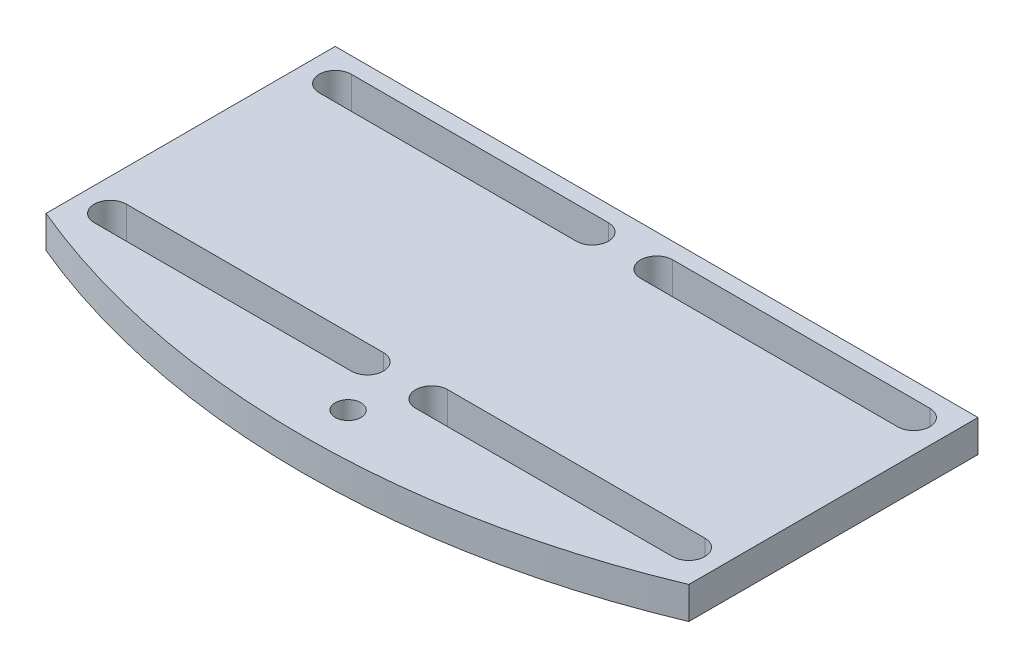
ISO-10303-21;
HEADER;
FILE_DESCRIPTION(('STEP AP214'),'2;1');
FILE_NAME('part.step','',(''),(''),'','','');
FILE_SCHEMA(('AUTOMOTIVE_DESIGN { 1 0 10303 214 1 1 1 1 }'));
ENDSEC;
DATA;
#1=APPLICATION_CONTEXT('core data for automotive mechanical design processes');
#2=APPLICATION_PROTOCOL_DEFINITION('international standard','automotive_design',2000,#1);
#3=PRODUCT_CONTEXT('',#1,'mechanical');
#4=PRODUCT('Part','Part','',(#3));
#5=PRODUCT_RELATED_PRODUCT_CATEGORY('part','',(#4));
#6=PRODUCT_DEFINITION_FORMATION('','',#4);
#7=PRODUCT_DEFINITION_CONTEXT('part definition',#1,'design');
#8=PRODUCT_DEFINITION('design','',#6,#7);
#9=PRODUCT_DEFINITION_SHAPE('','',#8);
#10=(LENGTH_UNIT() NAMED_UNIT(*) SI_UNIT(.MILLI.,.METRE.));
#11=(NAMED_UNIT(*) PLANE_ANGLE_UNIT() SI_UNIT($,.RADIAN.));
#12=(NAMED_UNIT(*) SI_UNIT($,.STERADIAN.) SOLID_ANGLE_UNIT());
#13=UNCERTAINTY_MEASURE_WITH_UNIT(LENGTH_MEASURE(1.E-05),#10,'distance_accuracy_value','');
#14=(GEOMETRIC_REPRESENTATION_CONTEXT(3) GLOBAL_UNCERTAINTY_ASSIGNED_CONTEXT((#13)) GLOBAL_UNIT_ASSIGNED_CONTEXT((#10,
#11,#12)) REPRESENTATION_CONTEXT('',''));
#15=CARTESIAN_POINT('',(0.,0.,0.));
#16=DIRECTION('',(0.,0.,1.));
#17=DIRECTION('',(1.,0.,0.));
#18=AXIS2_PLACEMENT_3D('',#15,#16,#17);
#19=CARTESIAN_POINT('',(-3.05311331771918E-13,5.,-79.9999999999985));
#20=DIRECTION('',(0.,1.,0.));
#21=DIRECTION('',(0.,0.,1.));
#22=AXIS2_PLACEMENT_3D('',#19,#20,#21);
#23=PLANE('',#22);
#24=CARTESIAN_POINT('',(0.,5.,43.));
#25=DIRECTION('',(0.,1.,0.));
#26=DIRECTION('',(0.,0.,1.));
#27=AXIS2_PLACEMENT_3D('',#24,#25,#26);
#28=CIRCLE('',#27,2.);
#29=CARTESIAN_POINT('',(0.,5.,45.));
#30=VERTEX_POINT('',#29);
#31=EDGE_CURVE('E512',#30,#30,#28,.T.);
#32=ORIENTED_EDGE('',*,*,#31,.F.);
#33=EDGE_LOOP('',(#32));
#34=FACE_BOUND('',#33,.T.);
#35=CARTESIAN_POINT('',(-45.,5.,35.));
#36=DIRECTION('',(0.,1.,0.));
#37=DIRECTION('',(0.,0.,1.));
#38=AXIS2_PLACEMENT_3D('',#35,#36,#37);
#39=CIRCLE('',#38,2.5);
#40=CARTESIAN_POINT('',(-45.,5.,32.5));
#41=VERTEX_POINT('',#40);
#42=CARTESIAN_POINT('',(-45.,5.,37.5));
#43=VERTEX_POINT('',#42);
#44=EDGE_CURVE('E282',#41,#43,#39,.T.);
#45=ORIENTED_EDGE('',*,*,#44,.F.);
#46=DIRECTION('',(-1.,0.,0.));
#47=VECTOR('',#46,1.);
#48=CARTESIAN_POINT('',(-45.,5.,32.5));
#49=LINE('',#48,#47);
#50=CARTESIAN_POINT('',(-5.,5.,32.5));
#51=VERTEX_POINT('',#50);
#52=EDGE_CURVE('E293',#51,#41,#49,.T.);
#53=ORIENTED_EDGE('',*,*,#52,.F.);
#54=CARTESIAN_POINT('',(-5.,5.,35.));
#55=DIRECTION('',(0.,1.,0.));
#56=DIRECTION('',(0.,0.,1.));
#57=AXIS2_PLACEMENT_3D('',#54,#55,#56);
#58=CIRCLE('',#57,2.5);
#59=CARTESIAN_POINT('',(-5.,5.,37.5));
#60=VERTEX_POINT('',#59);
#61=EDGE_CURVE('E289',#60,#51,#58,.T.);
#62=ORIENTED_EDGE('',*,*,#61,.F.);
#63=DIRECTION('',(1.,0.,0.));
#64=VECTOR('',#63,1.);
#65=CARTESIAN_POINT('',(-45.,5.,37.5));
#66=LINE('',#65,#64);
#67=EDGE_CURVE('E285',#43,#60,#66,.T.);
#68=ORIENTED_EDGE('',*,*,#67,.F.);
#69=EDGE_LOOP('',(#45,#53,#62,#68));
#70=FACE_BOUND('',#69,.T.);
#71=CARTESIAN_POINT('',(-45.,5.,0.));
#72=DIRECTION('',(0.,1.,0.));
#73=DIRECTION('',(0.,0.,1.));
#74=AXIS2_PLACEMENT_3D('',#71,#72,#73);
#75=CIRCLE('',#74,2.5);
#76=CARTESIAN_POINT('',(-45.,5.,-2.5));
#77=VERTEX_POINT('',#76);
#78=CARTESIAN_POINT('',(-45.,5.,2.5));
#79=VERTEX_POINT('',#78);
#80=EDGE_CURVE('E325',#77,#79,#75,.T.);
#81=ORIENTED_EDGE('',*,*,#80,.F.);
#82=DIRECTION('',(-1.,0.,0.));
#83=VECTOR('',#82,1.);
#84=CARTESIAN_POINT('',(-45.,5.,-2.5));
#85=LINE('',#84,#83);
#86=CARTESIAN_POINT('',(-5.,5.,-2.5));
#87=VERTEX_POINT('',#86);
#88=EDGE_CURVE('E336',#87,#77,#85,.T.);
#89=ORIENTED_EDGE('',*,*,#88,.F.);
#90=CARTESIAN_POINT('',(-5.,5.,0.));
#91=DIRECTION('',(0.,1.,0.));
#92=DIRECTION('',(0.,0.,1.));
#93=AXIS2_PLACEMENT_3D('',#90,#91,#92);
#94=CIRCLE('',#93,2.5);
#95=CARTESIAN_POINT('',(-5.,5.,2.5));
#96=VERTEX_POINT('',#95);
#97=EDGE_CURVE('E332',#96,#87,#94,.T.);
#98=ORIENTED_EDGE('',*,*,#97,.F.);
#99=DIRECTION('',(1.,0.,0.));
#100=VECTOR('',#99,1.);
#101=CARTESIAN_POINT('',(-45.,5.,2.5));
#102=LINE('',#101,#100);
#103=EDGE_CURVE('E328',#79,#96,#102,.T.);
#104=ORIENTED_EDGE('',*,*,#103,.F.);
#105=EDGE_LOOP('',(#81,#89,#98,#104));
#106=FACE_BOUND('',#105,.T.);
#107=DIRECTION('',(0.,0.,1.));
#108=VECTOR('',#107,1.);
#109=CARTESIAN_POINT('',(-50.,5.,40.));
#110=LINE('',#109,#108);
#111=CARTESIAN_POINT('',(-50.,5.,-4.99999999999999));
#112=VERTEX_POINT('',#111);
#113=CARTESIAN_POINT('',(-50.,5.,40.0000000000001));
#114=VERTEX_POINT('',#113);
#115=EDGE_CURVE('E356',#112,#114,#110,.T.);
#116=ORIENTED_EDGE('',*,*,#115,.T.);
#117=CARTESIAN_POINT('',(-3.05311331771918E-13,5.,-79.9999999999985));
#118=DIRECTION('',(0.,1.,0.));
#119=DIRECTION('',(0.,0.,1.));
#120=AXIS2_PLACEMENT_3D('',#117,#118,#119);
#121=CIRCLE('',#120,129.999999999999);
#122=CARTESIAN_POINT('',(50.,5.,40.));
#123=VERTEX_POINT('',#122);
#124=EDGE_CURVE('E360',#114,#123,#121,.T.);
#125=ORIENTED_EDGE('',*,*,#124,.T.);
#126=DIRECTION('',(0.,0.,-1.));
#127=VECTOR('',#126,1.);
#128=CARTESIAN_POINT('',(50.,5.,40.));
#129=LINE('',#128,#127);
#130=CARTESIAN_POINT('',(50.,5.,-5.));
#131=VERTEX_POINT('',#130);
#132=EDGE_CURVE('E364',#123,#131,#129,.T.);
#133=ORIENTED_EDGE('',*,*,#132,.T.);
#134=DIRECTION('',(-1.,0.,0.));
#135=VECTOR('',#134,1.);
#136=CARTESIAN_POINT('',(50.,5.,-5.));
#137=LINE('',#136,#135);
#138=EDGE_CURVE('E367',#131,#112,#137,.T.);
#139=ORIENTED_EDGE('',*,*,#138,.T.);
#140=EDGE_LOOP('',(#116,#125,#133,#139));
#141=FACE_BOUND('',#140,.T.);
#142=DIRECTION('',(1.,0.,0.));
#143=VECTOR('',#142,1.);
#144=CARTESIAN_POINT('',(45.,5.,-2.5));
#145=LINE('',#144,#143);
#146=CARTESIAN_POINT('',(5.,5.,-2.5));
#147=VERTEX_POINT('',#146);
#148=CARTESIAN_POINT('',(45.,5.,-2.5));
#149=VERTEX_POINT('',#148);
#150=EDGE_CURVE('E242',#147,#149,#145,.T.);
#151=ORIENTED_EDGE('',*,*,#150,.T.);
#152=CARTESIAN_POINT('',(45.,5.,0.));
#153=DIRECTION('',(0.,-1.,0.));
#154=DIRECTION('',(0.,0.,1.));
#155=AXIS2_PLACEMENT_3D('',#152,#153,#154);
#156=CIRCLE('',#155,2.5);
#157=CARTESIAN_POINT('',(45.,5.,2.5));
#158=VERTEX_POINT('',#157);
#159=EDGE_CURVE('E63',#149,#158,#156,.T.);
#160=ORIENTED_EDGE('',*,*,#159,.T.);
#161=DIRECTION('',(-1.,0.,0.));
#162=VECTOR('',#161,1.);
#163=CARTESIAN_POINT('',(45.,5.,2.5));
#164=LINE('',#163,#162);
#165=CARTESIAN_POINT('',(5.,5.,2.5));
#166=VERTEX_POINT('',#165);
#167=EDGE_CURVE('E250',#158,#166,#164,.T.);
#168=ORIENTED_EDGE('',*,*,#167,.T.);
#169=CARTESIAN_POINT('',(5.,5.,0.));
#170=DIRECTION('',(0.,-1.,0.));
#171=DIRECTION('',(0.,0.,1.));
#172=AXIS2_PLACEMENT_3D('',#169,#170,#171);
#173=CIRCLE('',#172,2.5);
#174=EDGE_CURVE('E246',#166,#147,#173,.T.);
#175=ORIENTED_EDGE('',*,*,#174,.T.);
#176=EDGE_LOOP('',(#151,#160,#168,#175));
#177=FACE_BOUND('',#176,.T.);
#178=DIRECTION('',(1.,0.,0.));
#179=VECTOR('',#178,1.);
#180=CARTESIAN_POINT('',(45.,5.,32.5));
#181=LINE('',#180,#179);
#182=CARTESIAN_POINT('',(5.,5.,32.5));
#183=VERTEX_POINT('',#182);
#184=CARTESIAN_POINT('',(45.,5.,32.5));
#185=VERTEX_POINT('',#184);
#186=EDGE_CURVE('E205',#183,#185,#181,.T.);
#187=ORIENTED_EDGE('',*,*,#186,.T.);
#188=CARTESIAN_POINT('',(45.,5.,35.));
#189=DIRECTION('',(0.,-1.,0.));
#190=DIRECTION('',(0.,0.,1.));
#191=AXIS2_PLACEMENT_3D('',#188,#189,#190);
#192=CIRCLE('',#191,2.5);
#193=CARTESIAN_POINT('',(45.,5.,37.5));
#194=VERTEX_POINT('',#193);
#195=EDGE_CURVE('E55',#185,#194,#192,.T.);
#196=ORIENTED_EDGE('',*,*,#195,.T.);
#197=DIRECTION('',(-1.,0.,0.));
#198=VECTOR('',#197,1.);
#199=CARTESIAN_POINT('',(45.,5.,37.5));
#200=LINE('',#199,#198);
#201=CARTESIAN_POINT('',(5.,5.,37.5));
#202=VERTEX_POINT('',#201);
#203=EDGE_CURVE('E196',#194,#202,#200,.T.);
#204=ORIENTED_EDGE('',*,*,#203,.T.);
#205=CARTESIAN_POINT('',(5.,5.,35.));
#206=DIRECTION('',(0.,-1.,0.));
#207=DIRECTION('',(0.,0.,1.));
#208=AXIS2_PLACEMENT_3D('',#205,#206,#207);
#209=CIRCLE('',#208,2.5);
#210=EDGE_CURVE('E213',#202,#183,#209,.T.);
#211=ORIENTED_EDGE('',*,*,#210,.T.);
#212=EDGE_LOOP('',(#187,#196,#204,#211));
#213=FACE_BOUND('',#212,.T.);
#214=ADVANCED_FACE('F39',(#34,#70,#106,#141,#177,#213),#23,.T.);
#215=CARTESIAN_POINT('',(-3.05311331771918E-13,0.,-79.9999999999985));
#216=DIRECTION('',(0.,1.,0.));
#217=DIRECTION('',(0.,0.,1.));
#218=AXIS2_PLACEMENT_3D('',#215,#216,#217);
#219=PLANE('',#218);
#220=CARTESIAN_POINT('',(0.,0.,43.));
#221=DIRECTION('',(0.,1.,0.));
#222=DIRECTION('',(0.,0.,1.));
#223=AXIS2_PLACEMENT_3D('',#220,#221,#222);
#224=CIRCLE('',#223,2.);
#225=CARTESIAN_POINT('',(0.,0.,45.));
#226=VERTEX_POINT('',#225);
#227=EDGE_CURVE('E232',#226,#226,#224,.F.);
#228=ORIENTED_EDGE('',*,*,#227,.F.);
#229=EDGE_LOOP('',(#228));
#230=FACE_BOUND('',#229,.T.);
#231=CARTESIAN_POINT('',(45.,0.,0.));
#232=DIRECTION('',(0.,1.,0.));
#233=DIRECTION('',(0.,0.,1.));
#234=AXIS2_PLACEMENT_3D('',#231,#232,#233);
#235=CIRCLE('',#234,2.5);
#236=CARTESIAN_POINT('',(45.,0.,2.5));
#237=VERTEX_POINT('',#236);
#238=CARTESIAN_POINT('',(45.,0.,-2.5));
#239=VERTEX_POINT('',#238);
#240=EDGE_CURVE('E236',#237,#239,#235,.T.);
#241=ORIENTED_EDGE('',*,*,#240,.T.);
#242=DIRECTION('',(-1.,0.,0.));
#243=VECTOR('',#242,1.);
#244=CARTESIAN_POINT('',(45.,0.,-2.5));
#245=LINE('',#244,#243);
#246=CARTESIAN_POINT('',(5.,0.,-2.5));
#247=VERTEX_POINT('',#246);
#248=EDGE_CURVE('E258',#239,#247,#245,.T.);
#249=ORIENTED_EDGE('',*,*,#248,.T.);
#250=CARTESIAN_POINT('',(5.,0.,0.));
#251=DIRECTION('',(0.,1.,0.));
#252=DIRECTION('',(0.,0.,1.));
#253=AXIS2_PLACEMENT_3D('',#250,#251,#252);
#254=CIRCLE('',#253,2.5);
#255=CARTESIAN_POINT('',(5.,0.,2.5));
#256=VERTEX_POINT('',#255);
#257=EDGE_CURVE('E227',#247,#256,#254,.T.);
#258=ORIENTED_EDGE('',*,*,#257,.T.);
#259=DIRECTION('',(1.,0.,0.));
#260=VECTOR('',#259,1.);
#261=CARTESIAN_POINT('',(45.,0.,2.5));
#262=LINE('',#261,#260);
#263=EDGE_CURVE('E231',#256,#237,#262,.T.);
#264=ORIENTED_EDGE('',*,*,#263,.T.);
#265=EDGE_LOOP('',(#241,#249,#258,#264));
#266=FACE_BOUND('',#265,.T.);
#267=DIRECTION('',(1.,0.,0.));
#268=VECTOR('',#267,1.);
#269=CARTESIAN_POINT('',(-45.,0.,32.5));
#270=LINE('',#269,#268);
#271=CARTESIAN_POINT('',(-45.,0.,32.5));
#272=VERTEX_POINT('',#271);
#273=CARTESIAN_POINT('',(-5.,0.,32.5));
#274=VERTEX_POINT('',#273);
#275=EDGE_CURVE('E273',#272,#274,#270,.T.);
#276=ORIENTED_EDGE('',*,*,#275,.F.);
#277=CARTESIAN_POINT('',(-45.,0.,35.));
#278=DIRECTION('',(0.,1.,0.));
#279=DIRECTION('',(0.,0.,1.));
#280=AXIS2_PLACEMENT_3D('',#277,#278,#279);
#281=CIRCLE('',#280,2.5);
#282=CARTESIAN_POINT('',(-45.,0.,37.5));
#283=VERTEX_POINT('',#282);
#284=EDGE_CURVE('E278',#283,#272,#281,.F.);
#285=ORIENTED_EDGE('',*,*,#284,.F.);
#286=DIRECTION('',(-1.,0.,0.));
#287=VECTOR('',#286,1.);
#288=CARTESIAN_POINT('',(-45.,0.,37.5));
#289=LINE('',#288,#287);
#290=CARTESIAN_POINT('',(-5.,0.,37.5));
#291=VERTEX_POINT('',#290);
#292=EDGE_CURVE('E301',#291,#283,#289,.T.);
#293=ORIENTED_EDGE('',*,*,#292,.F.);
#294=CARTESIAN_POINT('',(-5.,0.,35.));
#295=DIRECTION('',(0.,1.,0.));
#296=DIRECTION('',(0.,0.,1.));
#297=AXIS2_PLACEMENT_3D('',#294,#295,#296);
#298=CIRCLE('',#297,2.5);
#299=EDGE_CURVE('E270',#274,#291,#298,.F.);
#300=ORIENTED_EDGE('',*,*,#299,.F.);
#301=EDGE_LOOP('',(#276,#285,#293,#300));
#302=FACE_BOUND('',#301,.T.);
#303=DIRECTION('',(1.,0.,0.));
#304=VECTOR('',#303,1.);
#305=CARTESIAN_POINT('',(-45.,0.,-2.5));
#306=LINE('',#305,#304);
#307=CARTESIAN_POINT('',(-45.,0.,-2.5));
#308=VERTEX_POINT('',#307);
#309=CARTESIAN_POINT('',(-5.,0.,-2.5));
#310=VERTEX_POINT('',#309);
#311=EDGE_CURVE('E317',#308,#310,#306,.T.);
#312=ORIENTED_EDGE('',*,*,#311,.F.);
#313=CARTESIAN_POINT('',(-45.,0.,0.));
#314=DIRECTION('',(0.,1.,0.));
#315=DIRECTION('',(0.,0.,1.));
#316=AXIS2_PLACEMENT_3D('',#313,#314,#315);
#317=CIRCLE('',#316,2.5);
#318=CARTESIAN_POINT('',(-45.,0.,2.5));
#319=VERTEX_POINT('',#318);
#320=EDGE_CURVE('E321',#319,#308,#317,.F.);
#321=ORIENTED_EDGE('',*,*,#320,.F.);
#322=DIRECTION('',(-1.,0.,0.));
#323=VECTOR('',#322,1.);
#324=CARTESIAN_POINT('',(-45.,0.,2.5));
#325=LINE('',#324,#323);
#326=CARTESIAN_POINT('',(-5.,0.,2.5));
#327=VERTEX_POINT('',#326);
#328=EDGE_CURVE('E274',#327,#319,#325,.T.);
#329=ORIENTED_EDGE('',*,*,#328,.F.);
#330=CARTESIAN_POINT('',(-5.,0.,0.));
#331=DIRECTION('',(0.,1.,0.));
#332=DIRECTION('',(0.,0.,1.));
#333=AXIS2_PLACEMENT_3D('',#330,#331,#332);
#334=CIRCLE('',#333,2.5);
#335=EDGE_CURVE('E189',#310,#327,#334,.F.);
#336=ORIENTED_EDGE('',*,*,#335,.F.);
#337=EDGE_LOOP('',(#312,#321,#329,#336));
#338=FACE_BOUND('',#337,.T.);
#339=DIRECTION('',(0.,0.,1.));
#340=VECTOR('',#339,1.);
#341=CARTESIAN_POINT('',(-50.,0.,40.));
#342=LINE('',#341,#340);
#343=CARTESIAN_POINT('',(-50.,0.,-4.99999999999999));
#344=VERTEX_POINT('',#343);
#345=CARTESIAN_POINT('',(-50.,0.,40.0000000000001));
#346=VERTEX_POINT('',#345);
#347=EDGE_CURVE('E314',#344,#346,#342,.T.);
#348=ORIENTED_EDGE('',*,*,#347,.F.);
#349=DIRECTION('',(-1.,0.,0.));
#350=VECTOR('',#349,1.);
#351=CARTESIAN_POINT('',(50.,0.,-5.));
#352=LINE('',#351,#350);
#353=CARTESIAN_POINT('',(50.,0.,-5.));
#354=VERTEX_POINT('',#353);
#355=EDGE_CURVE('E361',#354,#344,#352,.T.);
#356=ORIENTED_EDGE('',*,*,#355,.F.);
#357=DIRECTION('',(0.,0.,-1.));
#358=VECTOR('',#357,1.);
#359=CARTESIAN_POINT('',(50.,0.,40.));
#360=LINE('',#359,#358);
#361=CARTESIAN_POINT('',(50.,0.,40.));
#362=VERTEX_POINT('',#361);
#363=EDGE_CURVE('E377',#362,#354,#360,.T.);
#364=ORIENTED_EDGE('',*,*,#363,.F.);
#365=CARTESIAN_POINT('',(-3.05311331771918E-13,0.,-79.9999999999985));
#366=DIRECTION('',(0.,1.,0.));
#367=DIRECTION('',(0.,0.,1.));
#368=AXIS2_PLACEMENT_3D('',#365,#366,#367);
#369=CIRCLE('',#368,129.999999999999);
#370=EDGE_CURVE('E374',#346,#362,#369,.T.);
#371=ORIENTED_EDGE('',*,*,#370,.F.);
#372=EDGE_LOOP('',(#348,#356,#364,#371));
#373=FACE_BOUND('',#372,.T.);
#374=CARTESIAN_POINT('',(45.,0.,35.));
#375=DIRECTION('',(0.,1.,0.));
#376=DIRECTION('',(0.,0.,1.));
#377=AXIS2_PLACEMENT_3D('',#374,#375,#376);
#378=CIRCLE('',#377,2.5);
#379=CARTESIAN_POINT('',(45.,0.,37.5));
#380=VERTEX_POINT('',#379);
#381=CARTESIAN_POINT('',(45.,0.,32.5));
#382=VERTEX_POINT('',#381);
#383=EDGE_CURVE('E193',#380,#382,#378,.T.);
#384=ORIENTED_EDGE('',*,*,#383,.T.);
#385=DIRECTION('',(-1.,0.,0.));
#386=VECTOR('',#385,1.);
#387=CARTESIAN_POINT('',(45.,0.,32.5));
#388=LINE('',#387,#386);
#389=CARTESIAN_POINT('',(5.,0.,32.5));
#390=VERTEX_POINT('',#389);
#391=EDGE_CURVE('E178',#382,#390,#388,.T.);
#392=ORIENTED_EDGE('',*,*,#391,.T.);
#393=CARTESIAN_POINT('',(5.,0.,35.));
#394=DIRECTION('',(0.,1.,0.));
#395=DIRECTION('',(0.,0.,1.));
#396=AXIS2_PLACEMENT_3D('',#393,#394,#395);
#397=CIRCLE('',#396,2.5);
#398=CARTESIAN_POINT('',(5.,0.,37.5));
#399=VERTEX_POINT('',#398);
#400=EDGE_CURVE('E207',#390,#399,#397,.T.);
#401=ORIENTED_EDGE('',*,*,#400,.T.);
#402=DIRECTION('',(1.,0.,0.));
#403=VECTOR('',#402,1.);
#404=CARTESIAN_POINT('',(45.,0.,37.5));
#405=LINE('',#404,#403);
#406=EDGE_CURVE('E200',#399,#380,#405,.T.);
#407=ORIENTED_EDGE('',*,*,#406,.T.);
#408=EDGE_LOOP('',(#384,#392,#401,#407));
#409=FACE_BOUND('',#408,.T.);
#410=ADVANCED_FACE('F199',(#230,#266,#302,#338,#373,#409),#219,.F.);
#411=CARTESIAN_POINT('',(-50.,5.,40.));
#412=DIRECTION('',(1.,0.,0.));
#413=DIRECTION('',(0.,0.,-1.));
#414=AXIS2_PLACEMENT_3D('',#411,#412,#413);
#415=PLANE('',#414);
#416=ORIENTED_EDGE('',*,*,#347,.T.);
#417=DIRECTION('',(0.,-1.,0.));
#418=VECTOR('',#417,1.);
#419=CARTESIAN_POINT('',(-50.,5.,40.0000000000001));
#420=LINE('',#419,#418);
#421=EDGE_CURVE('E11',#114,#346,#420,.T.);
#422=ORIENTED_EDGE('',*,*,#421,.F.);
#423=ORIENTED_EDGE('',*,*,#115,.F.);
#424=DIRECTION('',(0.,-1.,0.));
#425=VECTOR('',#424,1.);
#426=CARTESIAN_POINT('',(-50.,5.,-4.99999999999999));
#427=LINE('',#426,#425);
#428=EDGE_CURVE('E370',#112,#344,#427,.T.);
#429=ORIENTED_EDGE('',*,*,#428,.T.);
#430=EDGE_LOOP('',(#416,#422,#423,#429));
#431=FACE_BOUND('',#430,.T.);
#432=ADVANCED_FACE('F41',(#431),#415,.F.);
#433=CARTESIAN_POINT('',(-3.05311331771918E-13,5.,-79.9999999999985));
#434=DIRECTION('',(0.,-1.,0.));
#435=DIRECTION('',(0.,0.,-1.));
#436=AXIS2_PLACEMENT_3D('',#433,#434,#435);
#437=CYLINDRICAL_SURFACE('',#436,129.999999999999);
#438=ORIENTED_EDGE('',*,*,#370,.T.);
#439=DIRECTION('',(0.,-1.,0.));
#440=VECTOR('',#439,1.);
#441=CARTESIAN_POINT('',(50.,5.,40.));
#442=LINE('',#441,#440);
#443=EDGE_CURVE('E48',#123,#362,#442,.T.);
#444=ORIENTED_EDGE('',*,*,#443,.F.);
#445=ORIENTED_EDGE('',*,*,#124,.F.);
#446=ORIENTED_EDGE('',*,*,#421,.T.);
#447=EDGE_LOOP('',(#438,#444,#445,#446));
#448=FACE_BOUND('',#447,.T.);
#449=ADVANCED_FACE('F409',(#448),#437,.T.);
#450=CARTESIAN_POINT('',(50.,5.,40.));
#451=DIRECTION('',(-1.,0.,0.));
#452=DIRECTION('',(0.,0.,1.));
#453=AXIS2_PLACEMENT_3D('',#450,#451,#452);
#454=PLANE('',#453);
#455=ORIENTED_EDGE('',*,*,#363,.T.);
#456=DIRECTION('',(0.,-1.,0.));
#457=VECTOR('',#456,1.);
#458=CARTESIAN_POINT('',(50.,5.,-5.));
#459=LINE('',#458,#457);
#460=EDGE_CURVE('E385',#131,#354,#459,.T.);
#461=ORIENTED_EDGE('',*,*,#460,.F.);
#462=ORIENTED_EDGE('',*,*,#132,.F.);
#463=ORIENTED_EDGE('',*,*,#443,.T.);
#464=EDGE_LOOP('',(#455,#461,#462,#463));
#465=FACE_BOUND('',#464,.T.);
#466=ADVANCED_FACE('F394',(#465),#454,.F.);
#467=CARTESIAN_POINT('',(50.,5.,-5.));
#468=DIRECTION('',(0.,0.,1.));
#469=DIRECTION('',(1.,0.,0.));
#470=AXIS2_PLACEMENT_3D('',#467,#468,#469);
#471=PLANE('',#470);
#472=ORIENTED_EDGE('',*,*,#355,.T.);
#473=ORIENTED_EDGE('',*,*,#428,.F.);
#474=ORIENTED_EDGE('',*,*,#138,.F.);
#475=ORIENTED_EDGE('',*,*,#460,.T.);
#476=EDGE_LOOP('',(#472,#473,#474,#475));
#477=FACE_BOUND('',#476,.T.);
#478=ADVANCED_FACE('F402',(#477),#471,.F.);
#479=CARTESIAN_POINT('',(-45.,-0.00100000000000013,0.));
#480=DIRECTION('',(0.,1.,0.));
#481=DIRECTION('',(0.,0.,1.));
#482=AXIS2_PLACEMENT_3D('',#479,#480,#481);
#483=CYLINDRICAL_SURFACE('',#482,2.5);
#484=ORIENTED_EDGE('',*,*,#320,.T.);
#485=DIRECTION('',(0.,1.,0.));
#486=VECTOR('',#485,1.);
#487=CARTESIAN_POINT('',(-45.,-0.00100000000000013,-2.5));
#488=LINE('',#487,#486);
#489=EDGE_CURVE('E341',#308,#77,#488,.T.);
#490=ORIENTED_EDGE('',*,*,#489,.T.);
#491=ORIENTED_EDGE('',*,*,#80,.T.);
#492=DIRECTION('',(0.,1.,0.));
#493=VECTOR('',#492,1.);
#494=CARTESIAN_POINT('',(-45.,-0.00100000000000013,2.5));
#495=LINE('',#494,#493);
#496=EDGE_CURVE('E340',#319,#79,#495,.T.);
#497=ORIENTED_EDGE('',*,*,#496,.F.);
#498=EDGE_LOOP('',(#484,#490,#491,#497));
#499=FACE_BOUND('',#498,.T.);
#500=ADVANCED_FACE('F427',(#499),#483,.F.);
#501=CARTESIAN_POINT('',(-45.,-0.00100000000000013,-2.5));
#502=DIRECTION('',(0.,0.,-1.));
#503=DIRECTION('',(-1.,0.,0.));
#504=AXIS2_PLACEMENT_3D('',#501,#502,#503);
#505=PLANE('',#504);
#506=ORIENTED_EDGE('',*,*,#311,.T.);
#507=DIRECTION('',(0.,1.,0.));
#508=VECTOR('',#507,1.);
#509=CARTESIAN_POINT('',(-5.,-0.00100000000000013,-2.5));
#510=LINE('',#509,#508);
#511=EDGE_CURVE('E344',#310,#87,#510,.T.);
#512=ORIENTED_EDGE('',*,*,#511,.T.);
#513=ORIENTED_EDGE('',*,*,#88,.T.);
#514=ORIENTED_EDGE('',*,*,#489,.F.);
#515=EDGE_LOOP('',(#506,#512,#513,#514));
#516=FACE_BOUND('',#515,.T.);
#517=ADVANCED_FACE('F434',(#516),#505,.F.);
#518=CARTESIAN_POINT('',(-5.,-0.00100000000000013,0.));
#519=DIRECTION('',(0.,1.,0.));
#520=DIRECTION('',(0.,0.,1.));
#521=AXIS2_PLACEMENT_3D('',#518,#519,#520);
#522=CYLINDRICAL_SURFACE('',#521,2.5);
#523=ORIENTED_EDGE('',*,*,#335,.T.);
#524=DIRECTION('',(0.,1.,0.));
#525=VECTOR('',#524,1.);
#526=CARTESIAN_POINT('',(-5.,-0.00100000000000013,2.5));
#527=LINE('',#526,#525);
#528=EDGE_CURVE('E347',#327,#96,#527,.T.);
#529=ORIENTED_EDGE('',*,*,#528,.T.);
#530=ORIENTED_EDGE('',*,*,#97,.T.);
#531=ORIENTED_EDGE('',*,*,#511,.F.);
#532=EDGE_LOOP('',(#523,#529,#530,#531));
#533=FACE_BOUND('',#532,.T.);
#534=ADVANCED_FACE('F439',(#533),#522,.F.);
#535=CARTESIAN_POINT('',(-45.,-0.00100000000000013,2.5));
#536=DIRECTION('',(0.,0.,1.));
#537=DIRECTION('',(1.,0.,0.));
#538=AXIS2_PLACEMENT_3D('',#535,#536,#537);
#539=PLANE('',#538);
#540=ORIENTED_EDGE('',*,*,#328,.T.);
#541=ORIENTED_EDGE('',*,*,#496,.T.);
#542=ORIENTED_EDGE('',*,*,#103,.T.);
#543=ORIENTED_EDGE('',*,*,#528,.F.);
#544=EDGE_LOOP('',(#540,#541,#542,#543));
#545=FACE_BOUND('',#544,.T.);
#546=ADVANCED_FACE('F453',(#545),#539,.F.);
#547=CARTESIAN_POINT('',(-45.,-0.00100000000000013,35.));
#548=DIRECTION('',(0.,1.,0.));
#549=DIRECTION('',(0.,0.,1.));
#550=AXIS2_PLACEMENT_3D('',#547,#548,#549);
#551=CYLINDRICAL_SURFACE('',#550,2.5);
#552=ORIENTED_EDGE('',*,*,#284,.T.);
#553=DIRECTION('',(0.,1.,0.));
#554=VECTOR('',#553,1.);
#555=CARTESIAN_POINT('',(-45.,-0.00100000000000013,32.5));
#556=LINE('',#555,#554);
#557=EDGE_CURVE('E298',#272,#41,#556,.T.);
#558=ORIENTED_EDGE('',*,*,#557,.T.);
#559=ORIENTED_EDGE('',*,*,#44,.T.);
#560=DIRECTION('',(0.,1.,0.));
#561=VECTOR('',#560,1.);
#562=CARTESIAN_POINT('',(-45.,-0.00100000000000013,37.5));
#563=LINE('',#562,#561);
#564=EDGE_CURVE('E297',#283,#43,#563,.T.);
#565=ORIENTED_EDGE('',*,*,#564,.F.);
#566=EDGE_LOOP('',(#552,#558,#559,#565));
#567=FACE_BOUND('',#566,.T.);
#568=ADVANCED_FACE('F461',(#567),#551,.F.);
#569=CARTESIAN_POINT('',(-45.,-0.00100000000000013,32.5));
#570=DIRECTION('',(0.,0.,-1.));
#571=DIRECTION('',(-1.,0.,0.));
#572=AXIS2_PLACEMENT_3D('',#569,#570,#571);
#573=PLANE('',#572);
#574=ORIENTED_EDGE('',*,*,#275,.T.);
#575=DIRECTION('',(0.,1.,0.));
#576=VECTOR('',#575,1.);
#577=CARTESIAN_POINT('',(-5.,-0.00100000000000013,32.5));
#578=LINE('',#577,#576);
#579=EDGE_CURVE('E302',#274,#51,#578,.T.);
#580=ORIENTED_EDGE('',*,*,#579,.T.);
#581=ORIENTED_EDGE('',*,*,#52,.T.);
#582=ORIENTED_EDGE('',*,*,#557,.F.);
#583=EDGE_LOOP('',(#574,#580,#581,#582));
#584=FACE_BOUND('',#583,.T.);
#585=ADVANCED_FACE('F465',(#584),#573,.F.);
#586=CARTESIAN_POINT('',(-5.,-0.00100000000000013,35.));
#587=DIRECTION('',(0.,1.,0.));
#588=DIRECTION('',(0.,0.,1.));
#589=AXIS2_PLACEMENT_3D('',#586,#587,#588);
#590=CYLINDRICAL_SURFACE('',#589,2.5);
#591=ORIENTED_EDGE('',*,*,#299,.T.);
#592=DIRECTION('',(0.,1.,0.));
#593=VECTOR('',#592,1.);
#594=CARTESIAN_POINT('',(-5.,-0.00100000000000013,37.5));
#595=LINE('',#594,#593);
#596=EDGE_CURVE('E305',#291,#60,#595,.T.);
#597=ORIENTED_EDGE('',*,*,#596,.T.);
#598=ORIENTED_EDGE('',*,*,#61,.T.);
#599=ORIENTED_EDGE('',*,*,#579,.F.);
#600=EDGE_LOOP('',(#591,#597,#598,#599));
#601=FACE_BOUND('',#600,.T.);
#602=ADVANCED_FACE('F471',(#601),#590,.F.);
#603=CARTESIAN_POINT('',(-45.,-0.00100000000000013,37.5));
#604=DIRECTION('',(0.,0.,1.));
#605=DIRECTION('',(1.,0.,0.));
#606=AXIS2_PLACEMENT_3D('',#603,#604,#605);
#607=PLANE('',#606);
#608=ORIENTED_EDGE('',*,*,#292,.T.);
#609=ORIENTED_EDGE('',*,*,#564,.T.);
#610=ORIENTED_EDGE('',*,*,#67,.T.);
#611=ORIENTED_EDGE('',*,*,#596,.F.);
#612=EDGE_LOOP('',(#608,#609,#610,#611));
#613=FACE_BOUND('',#612,.T.);
#614=ADVANCED_FACE('F467',(#613),#607,.F.);
#615=CARTESIAN_POINT('',(45.,-0.00100000000000013,0.));
#616=DIRECTION('',(0.,1.,0.));
#617=DIRECTION('',(0.,0.,1.));
#618=AXIS2_PLACEMENT_3D('',#615,#616,#617);
#619=CYLINDRICAL_SURFACE('',#618,2.5);
#620=DIRECTION('',(0.,1.,0.));
#621=VECTOR('',#620,1.);
#622=CARTESIAN_POINT('',(45.,-0.00100000000000013,2.5));
#623=LINE('',#622,#621);
#624=EDGE_CURVE('E255',#237,#158,#623,.T.);
#625=ORIENTED_EDGE('',*,*,#624,.T.);
#626=ORIENTED_EDGE('',*,*,#159,.F.);
#627=DIRECTION('',(0.,1.,0.));
#628=VECTOR('',#627,1.);
#629=CARTESIAN_POINT('',(45.,-0.00100000000000013,-2.5));
#630=LINE('',#629,#628);
#631=EDGE_CURVE('E254',#239,#149,#630,.T.);
#632=ORIENTED_EDGE('',*,*,#631,.F.);
#633=ORIENTED_EDGE('',*,*,#240,.F.);
#634=EDGE_LOOP('',(#625,#626,#632,#633));
#635=FACE_BOUND('',#634,.T.);
#636=ADVANCED_FACE('F470',(#635),#619,.F.);
#637=CARTESIAN_POINT('',(45.,-0.00100000000000013,2.5));
#638=DIRECTION('',(0.,0.,-1.));
#639=DIRECTION('',(-1.,0.,0.));
#640=AXIS2_PLACEMENT_3D('',#637,#638,#639);
#641=PLANE('',#640);
#642=DIRECTION('',(0.,1.,0.));
#643=VECTOR('',#642,1.);
#644=CARTESIAN_POINT('',(5.,-0.00100000000000013,2.5));
#645=LINE('',#644,#643);
#646=EDGE_CURVE('E259',#256,#166,#645,.T.);
#647=ORIENTED_EDGE('',*,*,#646,.T.);
#648=ORIENTED_EDGE('',*,*,#167,.F.);
#649=ORIENTED_EDGE('',*,*,#624,.F.);
#650=ORIENTED_EDGE('',*,*,#263,.F.);
#651=EDGE_LOOP('',(#647,#648,#649,#650));
#652=FACE_BOUND('',#651,.T.);
#653=ADVANCED_FACE('F481',(#652),#641,.T.);
#654=CARTESIAN_POINT('',(5.,-0.00100000000000013,0.));
#655=DIRECTION('',(0.,1.,0.));
#656=DIRECTION('',(0.,0.,1.));
#657=AXIS2_PLACEMENT_3D('',#654,#655,#656);
#658=CYLINDRICAL_SURFACE('',#657,2.5);
#659=DIRECTION('',(0.,1.,0.));
#660=VECTOR('',#659,1.);
#661=CARTESIAN_POINT('',(5.,-0.00100000000000013,-2.5));
#662=LINE('',#661,#660);
#663=EDGE_CURVE('E262',#247,#147,#662,.T.);
#664=ORIENTED_EDGE('',*,*,#663,.T.);
#665=ORIENTED_EDGE('',*,*,#174,.F.);
#666=ORIENTED_EDGE('',*,*,#646,.F.);
#667=ORIENTED_EDGE('',*,*,#257,.F.);
#668=EDGE_LOOP('',(#664,#665,#666,#667));
#669=FACE_BOUND('',#668,.T.);
#670=ADVANCED_FACE('F485',(#669),#658,.F.);
#671=CARTESIAN_POINT('',(45.,-0.00100000000000013,-2.5));
#672=DIRECTION('',(0.,0.,1.));
#673=DIRECTION('',(1.,0.,0.));
#674=AXIS2_PLACEMENT_3D('',#671,#672,#673);
#675=PLANE('',#674);
#676=ORIENTED_EDGE('',*,*,#631,.T.);
#677=ORIENTED_EDGE('',*,*,#150,.F.);
#678=ORIENTED_EDGE('',*,*,#663,.F.);
#679=ORIENTED_EDGE('',*,*,#248,.F.);
#680=EDGE_LOOP('',(#676,#677,#678,#679));
#681=FACE_BOUND('',#680,.T.);
#682=ADVANCED_FACE('F482',(#681),#675,.T.);
#683=CARTESIAN_POINT('',(45.,-0.00100000000000013,35.));
#684=DIRECTION('',(0.,1.,0.));
#685=DIRECTION('',(0.,0.,1.));
#686=AXIS2_PLACEMENT_3D('',#683,#684,#685);
#687=CYLINDRICAL_SURFACE('',#686,2.5);
#688=DIRECTION('',(0.,1.,0.));
#689=VECTOR('',#688,1.);
#690=CARTESIAN_POINT('',(45.,-0.00100000000000013,37.5));
#691=LINE('',#690,#689);
#692=EDGE_CURVE('E190',#380,#194,#691,.T.);
#693=ORIENTED_EDGE('',*,*,#692,.T.);
#694=ORIENTED_EDGE('',*,*,#195,.F.);
#695=DIRECTION('',(0.,1.,0.));
#696=VECTOR('',#695,1.);
#697=CARTESIAN_POINT('',(45.,-0.00100000000000013,32.5));
#698=LINE('',#697,#696);
#699=EDGE_CURVE('E181',#382,#185,#698,.T.);
#700=ORIENTED_EDGE('',*,*,#699,.F.);
#701=ORIENTED_EDGE('',*,*,#383,.F.);
#702=EDGE_LOOP('',(#693,#694,#700,#701));
#703=FACE_BOUND('',#702,.T.);
#704=ADVANCED_FACE('F192',(#703),#687,.F.);
#705=CARTESIAN_POINT('',(45.,-0.00100000000000013,37.5));
#706=DIRECTION('',(0.,0.,-1.));
#707=DIRECTION('',(-1.,0.,0.));
#708=AXIS2_PLACEMENT_3D('',#705,#706,#707);
#709=PLANE('',#708);
#710=DIRECTION('',(0.,1.,0.));
#711=VECTOR('',#710,1.);
#712=CARTESIAN_POINT('',(5.,-0.00100000000000013,37.5));
#713=LINE('',#712,#711);
#714=EDGE_CURVE('E222',#399,#202,#713,.T.);
#715=ORIENTED_EDGE('',*,*,#714,.T.);
#716=ORIENTED_EDGE('',*,*,#203,.F.);
#717=ORIENTED_EDGE('',*,*,#692,.F.);
#718=ORIENTED_EDGE('',*,*,#406,.F.);
#719=EDGE_LOOP('',(#715,#716,#717,#718));
#720=FACE_BOUND('',#719,.T.);
#721=ADVANCED_FACE('F495',(#720),#709,.T.);
#722=CARTESIAN_POINT('',(5.,-0.00100000000000013,35.));
#723=DIRECTION('',(0.,1.,0.));
#724=DIRECTION('',(0.,0.,1.));
#725=AXIS2_PLACEMENT_3D('',#722,#723,#724);
#726=CYLINDRICAL_SURFACE('',#725,2.5);
#727=DIRECTION('',(0.,1.,0.));
#728=VECTOR('',#727,1.);
#729=CARTESIAN_POINT('',(5.,-0.00100000000000013,32.5));
#730=LINE('',#729,#728);
#731=EDGE_CURVE('E183',#390,#183,#730,.T.);
#732=ORIENTED_EDGE('',*,*,#731,.T.);
#733=ORIENTED_EDGE('',*,*,#210,.F.);
#734=ORIENTED_EDGE('',*,*,#714,.F.);
#735=ORIENTED_EDGE('',*,*,#400,.F.);
#736=EDGE_LOOP('',(#732,#733,#734,#735));
#737=FACE_BOUND('',#736,.T.);
#738=ADVANCED_FACE('F499',(#737),#726,.F.);
#739=CARTESIAN_POINT('',(45.,-0.00100000000000013,32.5));
#740=DIRECTION('',(0.,0.,1.));
#741=DIRECTION('',(1.,0.,0.));
#742=AXIS2_PLACEMENT_3D('',#739,#740,#741);
#743=PLANE('',#742);
#744=ORIENTED_EDGE('',*,*,#699,.T.);
#745=ORIENTED_EDGE('',*,*,#186,.F.);
#746=ORIENTED_EDGE('',*,*,#731,.F.);
#747=ORIENTED_EDGE('',*,*,#391,.F.);
#748=EDGE_LOOP('',(#744,#745,#746,#747));
#749=FACE_BOUND('',#748,.T.);
#750=ADVANCED_FACE('F179',(#749),#743,.T.);
#751=CARTESIAN_POINT('',(0.,-0.00100000000000013,43.));
#752=DIRECTION('',(0.,1.,0.));
#753=DIRECTION('',(0.,0.,1.));
#754=AXIS2_PLACEMENT_3D('',#751,#752,#753);
#755=CYLINDRICAL_SURFACE('',#754,2.);
#756=ORIENTED_EDGE('',*,*,#31,.T.);
#757=EDGE_LOOP('',(#756));
#758=FACE_BOUND('',#757,.T.);
#759=ORIENTED_EDGE('',*,*,#227,.T.);
#760=EDGE_LOOP('',(#759));
#761=FACE_BOUND('',#760,.T.);
#762=ADVANCED_FACE('F498',(#758,#761),#755,.F.);
#763=CLOSED_SHELL('',(#214,#410,#432,#449,#466,#478,#500,#517,#534,#546,#568,#585,#602,#614,
#636,#653,#670,#682,#704,#721,#738,#750,#762));
#764=MANIFOLD_SOLID_BREP('B2',#763);
#765=ADVANCED_BREP_SHAPE_REPRESENTATION('',(#18,#764),#14);
#766=SHAPE_DEFINITION_REPRESENTATION(#9,#765);
ENDSEC;
END-ISO-10303-21;
